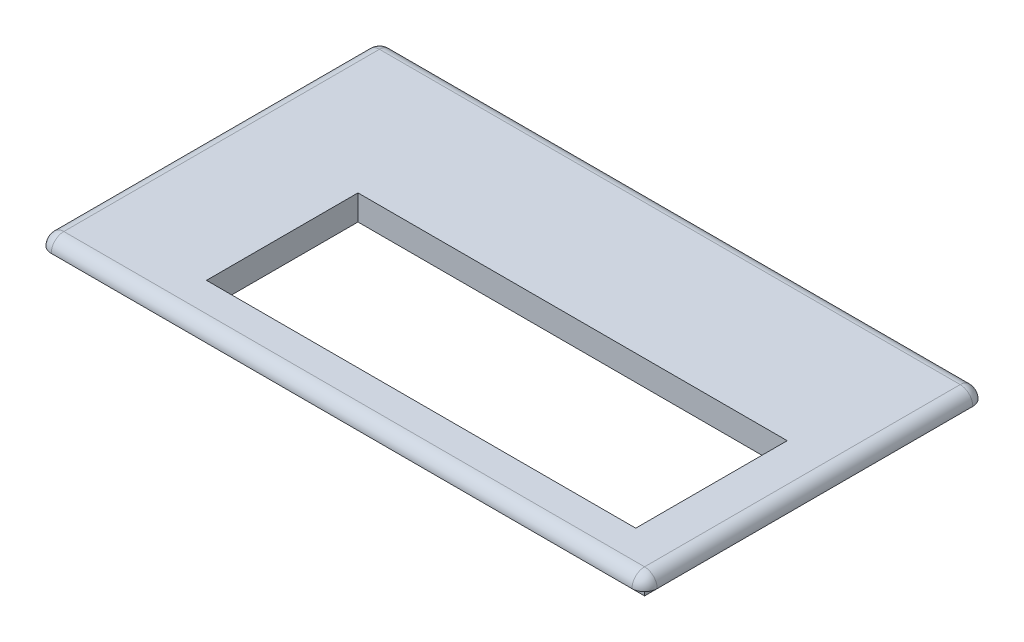
ISO-10303-21;
HEADER;
FILE_DESCRIPTION(('STEP AP214'),'2;1');
FILE_NAME('part.step','',(''),(''),'','','');
FILE_SCHEMA(('AUTOMOTIVE_DESIGN { 1 0 10303 214 1 1 1 1 }'));
ENDSEC;
DATA;
#1=APPLICATION_CONTEXT('core data for automotive mechanical design processes');
#2=APPLICATION_PROTOCOL_DEFINITION('international standard','automotive_design',2000,#1);
#3=PRODUCT_CONTEXT('',#1,'mechanical');
#4=PRODUCT('Part','Part','',(#3));
#5=PRODUCT_RELATED_PRODUCT_CATEGORY('part','',(#4));
#6=PRODUCT_DEFINITION_FORMATION('','',#4);
#7=PRODUCT_DEFINITION_CONTEXT('part definition',#1,'design');
#8=PRODUCT_DEFINITION('design','',#6,#7);
#9=PRODUCT_DEFINITION_SHAPE('','',#8);
#10=(LENGTH_UNIT() NAMED_UNIT(*) SI_UNIT(.MILLI.,.METRE.));
#11=(NAMED_UNIT(*) PLANE_ANGLE_UNIT() SI_UNIT($,.RADIAN.));
#12=(NAMED_UNIT(*) SI_UNIT($,.STERADIAN.) SOLID_ANGLE_UNIT());
#13=UNCERTAINTY_MEASURE_WITH_UNIT(LENGTH_MEASURE(1.E-05),#10,'distance_accuracy_value','');
#14=(GEOMETRIC_REPRESENTATION_CONTEXT(3) GLOBAL_UNCERTAINTY_ASSIGNED_CONTEXT((#13)) GLOBAL_UNIT_ASSIGNED_CONTEXT((#10,
#11,#12)) REPRESENTATION_CONTEXT('',''));
#15=CARTESIAN_POINT('',(0.,0.,0.));
#16=DIRECTION('',(0.,0.,1.));
#17=DIRECTION('',(1.,0.,0.));
#18=AXIS2_PLACEMENT_3D('',#15,#16,#17);
#19=CARTESIAN_POINT('',(-25.8656639223677,1.,-13.1153451083126));
#20=DIRECTION('',(1.,0.,0.));
#21=DIRECTION('',(0.,0.,-1.));
#22=AXIS2_PLACEMENT_3D('',#19,#20,#21);
#23=PLANE('',#22);
#24=DIRECTION('',(0.,0.,1.));
#25=VECTOR('',#24,1.);
#26=CARTESIAN_POINT('',(-25.8656639223677,0.,-13.1153451083126));
#27=LINE('',#26,#25);
#28=CARTESIAN_POINT('',(-25.8656639223677,0.,-13.1153451083126));
#29=VERTEX_POINT('',#28);
#30=CARTESIAN_POINT('',(-25.8656639223677,0.,11.8846548916874));
#31=VERTEX_POINT('',#30);
#32=EDGE_CURVE('E182',#29,#31,#27,.T.);
#33=ORIENTED_EDGE('',*,*,#32,.T.);
#34=DIRECTION('',(0.,-1.,0.));
#35=VECTOR('',#34,1.);
#36=CARTESIAN_POINT('',(-25.8656639223677,1.,11.8846548916874));
#37=LINE('',#36,#35);
#38=CARTESIAN_POINT('',(-25.8656639223677,1.,11.8846548916874));
#39=VERTEX_POINT('',#38);
#40=EDGE_CURVE('E212',#39,#31,#37,.T.);
#41=ORIENTED_EDGE('',*,*,#40,.F.);
#42=DIRECTION('',(0.,0.,1.));
#43=VECTOR('',#42,1.);
#44=CARTESIAN_POINT('',(-25.8656639223677,1.,-13.1153451083126));
#45=LINE('',#44,#43);
#46=CARTESIAN_POINT('',(-25.8656639223677,1.,-13.1153451083126));
#47=VERTEX_POINT('',#46);
#48=EDGE_CURVE('E183',#47,#39,#45,.T.);
#49=ORIENTED_EDGE('',*,*,#48,.F.);
#50=DIRECTION('',(0.,-1.,0.));
#51=VECTOR('',#50,1.);
#52=CARTESIAN_POINT('',(-25.8656639223677,1.,-13.1153451083126));
#53=LINE('',#52,#51);
#54=EDGE_CURVE('E196',#47,#29,#53,.T.);
#55=ORIENTED_EDGE('',*,*,#54,.T.);
#56=EDGE_LOOP('',(#33,#41,#49,#55));
#57=FACE_BOUND('',#56,.T.);
#58=ADVANCED_FACE('F33',(#57),#23,.F.);
#59=CARTESIAN_POINT('',(-25.8656639223677,1.,11.8846548916874));
#60=DIRECTION('',(0.,0.,-1.));
#61=DIRECTION('',(-1.,0.,0.));
#62=AXIS2_PLACEMENT_3D('',#59,#60,#61);
#63=PLANE('',#62);
#64=DIRECTION('',(1.,0.,0.));
#65=VECTOR('',#64,1.);
#66=CARTESIAN_POINT('',(-25.8656639223677,0.,11.8846548916874));
#67=LINE('',#66,#65);
#68=CARTESIAN_POINT('',(20.1343360776323,0.,11.8846548916874));
#69=VERTEX_POINT('',#68);
#70=EDGE_CURVE('E199',#31,#69,#67,.T.);
#71=ORIENTED_EDGE('',*,*,#70,.T.);
#72=DIRECTION('',(0.,-1.,0.));
#73=VECTOR('',#72,1.);
#74=CARTESIAN_POINT('',(20.1343360776323,1.,11.8846548916874));
#75=LINE('',#74,#73);
#76=CARTESIAN_POINT('',(20.1343360776323,1.,11.8846548916874));
#77=VERTEX_POINT('',#76);
#78=EDGE_CURVE('E209',#77,#69,#75,.T.);
#79=ORIENTED_EDGE('',*,*,#78,.F.);
#80=DIRECTION('',(1.,0.,0.));
#81=VECTOR('',#80,1.);
#82=CARTESIAN_POINT('',(-25.8656639223677,1.,11.8846548916874));
#83=LINE('',#82,#81);
#84=EDGE_CURVE('E186',#39,#77,#83,.T.);
#85=ORIENTED_EDGE('',*,*,#84,.F.);
#86=ORIENTED_EDGE('',*,*,#40,.T.);
#87=EDGE_LOOP('',(#71,#79,#85,#86));
#88=FACE_BOUND('',#87,.T.);
#89=ADVANCED_FACE('F289',(#88),#63,.F.);
#90=CARTESIAN_POINT('',(20.1343360776323,1.,-13.1153451083126));
#91=DIRECTION('',(-1.,0.,0.));
#92=DIRECTION('',(0.,0.,1.));
#93=AXIS2_PLACEMENT_3D('',#90,#91,#92);
#94=PLANE('',#93);
#95=DIRECTION('',(0.,0.,-1.));
#96=VECTOR('',#95,1.);
#97=CARTESIAN_POINT('',(20.1343360776323,0.,-13.1153451083126));
#98=LINE('',#97,#96);
#99=CARTESIAN_POINT('',(20.1343360776323,0.,-13.1153451083126));
#100=VERTEX_POINT('',#99);
#101=EDGE_CURVE('E201',#69,#100,#98,.T.);
#102=ORIENTED_EDGE('',*,*,#101,.T.);
#103=DIRECTION('',(0.,-1.,0.));
#104=VECTOR('',#103,1.);
#105=CARTESIAN_POINT('',(20.1343360776323,1.,-13.1153451083126));
#106=LINE('',#105,#104);
#107=CARTESIAN_POINT('',(20.1343360776323,1.,-13.1153451083126));
#108=VERTEX_POINT('',#107);
#109=EDGE_CURVE('E206',#108,#100,#106,.T.);
#110=ORIENTED_EDGE('',*,*,#109,.F.);
#111=DIRECTION('',(0.,0.,-1.));
#112=VECTOR('',#111,1.);
#113=CARTESIAN_POINT('',(20.1343360776323,1.,-13.1153451083126));
#114=LINE('',#113,#112);
#115=EDGE_CURVE('E190',#77,#108,#114,.T.);
#116=ORIENTED_EDGE('',*,*,#115,.F.);
#117=ORIENTED_EDGE('',*,*,#78,.T.);
#118=EDGE_LOOP('',(#102,#110,#116,#117));
#119=FACE_BOUND('',#118,.T.);
#120=ADVANCED_FACE('F295',(#119),#94,.F.);
#121=CARTESIAN_POINT('',(-25.8656639223677,1.,-13.1153451083126));
#122=DIRECTION('',(0.,0.,1.));
#123=DIRECTION('',(1.,0.,0.));
#124=AXIS2_PLACEMENT_3D('',#121,#122,#123);
#125=PLANE('',#124);
#126=DIRECTION('',(-1.,0.,0.));
#127=VECTOR('',#126,1.);
#128=CARTESIAN_POINT('',(-25.8656639223677,0.,-13.1153451083126));
#129=LINE('',#128,#127);
#130=EDGE_CURVE('E187',#100,#29,#129,.T.);
#131=ORIENTED_EDGE('',*,*,#130,.T.);
#132=ORIENTED_EDGE('',*,*,#54,.F.);
#133=DIRECTION('',(-1.,0.,0.));
#134=VECTOR('',#133,1.);
#135=CARTESIAN_POINT('',(-25.8656639223677,1.,-13.1153451083126));
#136=LINE('',#135,#134);
#137=EDGE_CURVE('E193',#108,#47,#136,.T.);
#138=ORIENTED_EDGE('',*,*,#137,.F.);
#139=ORIENTED_EDGE('',*,*,#109,.T.);
#140=EDGE_LOOP('',(#131,#132,#138,#139));
#141=FACE_BOUND('',#140,.T.);
#142=ADVANCED_FACE('F412',(#141),#125,.F.);
#143=CARTESIAN_POINT('',(0.,0.,0.));
#144=DIRECTION('',(0.,1.,0.));
#145=DIRECTION('',(0.,0.,1.));
#146=AXIS2_PLACEMENT_3D('',#143,#144,#145);
#147=PLANE('',#146);
#148=DIRECTION('',(1.,0.,0.));
#149=VECTOR('',#148,1.);
#150=CARTESIAN_POINT('',(-16.8656639223677,0.,-2.41534510831259));
#151=LINE('',#150,#149);
#152=CARTESIAN_POINT('',(-16.8656639223677,0.,-2.41534510831259));
#153=VERTEX_POINT('',#152);
#154=CARTESIAN_POINT('',(17.1343360776323,0.,-2.41534510831259));
#155=VERTEX_POINT('',#154);
#156=EDGE_CURVE('E140',#153,#155,#151,.T.);
#157=ORIENTED_EDGE('',*,*,#156,.F.);
#158=DIRECTION('',(0.,0.,1.));
#159=VECTOR('',#158,1.);
#160=CARTESIAN_POINT('',(-16.8656639223677,0.,-2.41534510831259));
#161=LINE('',#160,#159);
#162=CARTESIAN_POINT('',(-16.8656639223677,0.,9.58465489168741));
#163=VERTEX_POINT('',#162);
#164=EDGE_CURVE('E137',#153,#163,#161,.T.);
#165=ORIENTED_EDGE('',*,*,#164,.T.);
#166=DIRECTION('',(1.,0.,0.));
#167=VECTOR('',#166,1.);
#168=CARTESIAN_POINT('',(-16.8656639223677,0.,9.58465489168741));
#169=LINE('',#168,#167);
#170=CARTESIAN_POINT('',(17.1343360776323,0.,9.58465489168741));
#171=VERTEX_POINT('',#170);
#172=EDGE_CURVE('E143',#163,#171,#169,.T.);
#173=ORIENTED_EDGE('',*,*,#172,.T.);
#174=DIRECTION('',(0.,0.,1.));
#175=VECTOR('',#174,1.);
#176=CARTESIAN_POINT('',(17.1343360776323,0.,-2.41534510831259));
#177=LINE('',#176,#175);
#178=EDGE_CURVE('E147',#155,#171,#177,.T.);
#179=ORIENTED_EDGE('',*,*,#178,.F.);
#180=EDGE_LOOP('',(#157,#165,#173,#179));
#181=FACE_BOUND('',#180,.T.);
#182=ORIENTED_EDGE('',*,*,#32,.F.);
#183=ORIENTED_EDGE('',*,*,#130,.F.);
#184=ORIENTED_EDGE('',*,*,#101,.F.);
#185=ORIENTED_EDGE('',*,*,#70,.F.);
#186=EDGE_LOOP('',(#182,#183,#184,#185));
#187=FACE_BOUND('',#186,.T.);
#188=ADVANCED_FACE('F149',(#181,#187),#147,.F.);
#189=CARTESIAN_POINT('',(0.,1.,0.));
#190=DIRECTION('',(0.,1.,0.));
#191=DIRECTION('',(0.,0.,1.));
#192=AXIS2_PLACEMENT_3D('',#189,#190,#191);
#193=PLANE('',#192);
#194=DIRECTION('',(-1.,0.,0.));
#195=VECTOR('',#194,1.);
#196=CARTESIAN_POINT('',(-26.8656639223677,1.,-14.1153451083126));
#197=LINE('',#196,#195);
#198=CARTESIAN_POINT('',(20.1343360776323,1.,-14.1153451083126));
#199=VERTEX_POINT('',#198);
#200=CARTESIAN_POINT('',(-25.8656639223677,1.,-14.1153451083126));
#201=VERTEX_POINT('',#200);
#202=EDGE_CURVE('E179',#199,#201,#197,.T.);
#203=ORIENTED_EDGE('',*,*,#202,.F.);
#204=CARTESIAN_POINT('',(20.1343360776323,1.,-13.1153451083126));
#205=DIRECTION('',(0.,1.,0.));
#206=DIRECTION('',(0.,0.,1.));
#207=AXIS2_PLACEMENT_3D('',#204,#205,#206);
#208=CIRCLE('',#207,1.);
#209=CARTESIAN_POINT('',(21.1343360776323,1.,-13.1153451083126));
#210=VERTEX_POINT('',#209);
#211=EDGE_CURVE('E11',#199,#210,#208,.F.);
#212=ORIENTED_EDGE('',*,*,#211,.T.);
#213=DIRECTION('',(0.,0.,-1.));
#214=VECTOR('',#213,1.);
#215=CARTESIAN_POINT('',(21.1343360776323,1.,-14.1153451083126));
#216=LINE('',#215,#214);
#217=CARTESIAN_POINT('',(21.1343360776323,1.,11.8846548916874));
#218=VERTEX_POINT('',#217);
#219=EDGE_CURVE('E176',#218,#210,#216,.T.);
#220=ORIENTED_EDGE('',*,*,#219,.F.);
#221=CARTESIAN_POINT('',(20.1343360776323,1.,11.8846548916874));
#222=DIRECTION('',(0.,1.,0.));
#223=DIRECTION('',(0.,0.,1.));
#224=AXIS2_PLACEMENT_3D('',#221,#222,#223);
#225=CIRCLE('',#224,1.);
#226=CARTESIAN_POINT('',(20.1343360776323,1.,12.8846548916874));
#227=VERTEX_POINT('',#226);
#228=EDGE_CURVE('E42',#218,#227,#225,.F.);
#229=ORIENTED_EDGE('',*,*,#228,.T.);
#230=DIRECTION('',(1.,0.,0.));
#231=VECTOR('',#230,1.);
#232=CARTESIAN_POINT('',(-26.8656639223677,1.,12.8846548916874));
#233=LINE('',#232,#231);
#234=CARTESIAN_POINT('',(-25.8656639223677,1.,12.8846548916874));
#235=VERTEX_POINT('',#234);
#236=EDGE_CURVE('E173',#235,#227,#233,.T.);
#237=ORIENTED_EDGE('',*,*,#236,.F.);
#238=CARTESIAN_POINT('',(-25.8656639223677,1.,11.8846548916874));
#239=DIRECTION('',(0.,1.,0.));
#240=DIRECTION('',(0.,0.,1.));
#241=AXIS2_PLACEMENT_3D('',#238,#239,#240);
#242=CIRCLE('',#241,1.);
#243=CARTESIAN_POINT('',(-26.8656639223677,1.,11.8846548916874));
#244=VERTEX_POINT('',#243);
#245=EDGE_CURVE('E226',#235,#244,#242,.F.);
#246=ORIENTED_EDGE('',*,*,#245,.T.);
#247=DIRECTION('',(0.,0.,1.));
#248=VECTOR('',#247,1.);
#249=CARTESIAN_POINT('',(-26.8656639223677,1.,-14.1153451083126));
#250=LINE('',#249,#248);
#251=CARTESIAN_POINT('',(-26.8656639223677,1.,-13.1153451083126));
#252=VERTEX_POINT('',#251);
#253=EDGE_CURVE('E170',#252,#244,#250,.T.);
#254=ORIENTED_EDGE('',*,*,#253,.F.);
#255=CARTESIAN_POINT('',(-25.8656639223677,1.,-13.1153451083126));
#256=DIRECTION('',(0.,1.,0.));
#257=DIRECTION('',(0.,0.,1.));
#258=AXIS2_PLACEMENT_3D('',#255,#256,#257);
#259=CIRCLE('',#258,1.);
#260=EDGE_CURVE('E224',#252,#201,#259,.F.);
#261=ORIENTED_EDGE('',*,*,#260,.T.);
#262=EDGE_LOOP('',(#203,#212,#220,#229,#237,#246,#254,#261));
#263=FACE_BOUND('',#262,.T.);
#264=ORIENTED_EDGE('',*,*,#137,.T.);
#265=ORIENTED_EDGE('',*,*,#48,.T.);
#266=ORIENTED_EDGE('',*,*,#84,.T.);
#267=ORIENTED_EDGE('',*,*,#115,.T.);
#268=EDGE_LOOP('',(#264,#265,#266,#267));
#269=FACE_BOUND('',#268,.T.);
#270=ADVANCED_FACE('F259',(#263,#269),#193,.F.);
#271=CARTESIAN_POINT('',(0.,2.,0.));
#272=DIRECTION('',(0.,1.,0.));
#273=DIRECTION('',(0.,0.,1.));
#274=AXIS2_PLACEMENT_3D('',#271,#272,#273);
#275=PLANE('',#274);
#276=DIRECTION('',(0.,0.,1.));
#277=VECTOR('',#276,1.);
#278=CARTESIAN_POINT('',(-16.8656639223677,2.,-2.41534510831259));
#279=LINE('',#278,#277);
#280=CARTESIAN_POINT('',(-16.8656639223677,2.,-2.41534510831259));
#281=VERTEX_POINT('',#280);
#282=CARTESIAN_POINT('',(-16.8656639223677,2.,9.58465489168741));
#283=VERTEX_POINT('',#282);
#284=EDGE_CURVE('E58',#281,#283,#279,.T.);
#285=ORIENTED_EDGE('',*,*,#284,.F.);
#286=DIRECTION('',(1.,0.,0.));
#287=VECTOR('',#286,1.);
#288=CARTESIAN_POINT('',(-16.8656639223677,2.,-2.41534510831259));
#289=LINE('',#288,#287);
#290=CARTESIAN_POINT('',(17.1343360776323,2.,-2.41534510831259));
#291=VERTEX_POINT('',#290);
#292=EDGE_CURVE('E151',#281,#291,#289,.T.);
#293=ORIENTED_EDGE('',*,*,#292,.T.);
#294=DIRECTION('',(0.,0.,1.));
#295=VECTOR('',#294,1.);
#296=CARTESIAN_POINT('',(17.1343360776323,2.,-2.41534510831259));
#297=LINE('',#296,#295);
#298=CARTESIAN_POINT('',(17.1343360776323,2.,9.58465489168741));
#299=VERTEX_POINT('',#298);
#300=EDGE_CURVE('E154',#291,#299,#297,.T.);
#301=ORIENTED_EDGE('',*,*,#300,.T.);
#302=DIRECTION('',(1.,0.,0.));
#303=VECTOR('',#302,1.);
#304=CARTESIAN_POINT('',(-16.8656639223677,2.,9.58465489168741));
#305=LINE('',#304,#303);
#306=EDGE_CURVE('E160',#283,#299,#305,.T.);
#307=ORIENTED_EDGE('',*,*,#306,.F.);
#308=EDGE_LOOP('',(#285,#293,#301,#307));
#309=FACE_BOUND('',#308,.T.);
#310=DIRECTION('',(-1.,0.,0.));
#311=VECTOR('',#310,1.);
#312=CARTESIAN_POINT('',(-26.8656639223677,2.,-13.1153451083126));
#313=LINE('',#312,#311);
#314=CARTESIAN_POINT('',(20.1343360776323,2.,-13.1153451083126));
#315=VERTEX_POINT('',#314);
#316=CARTESIAN_POINT('',(-25.8656639223677,2.,-13.1153451083126));
#317=VERTEX_POINT('',#316);
#318=EDGE_CURVE('E217',#315,#317,#313,.T.);
#319=ORIENTED_EDGE('',*,*,#318,.T.);
#320=DIRECTION('',(0.,0.,1.));
#321=VECTOR('',#320,1.);
#322=CARTESIAN_POINT('',(-25.8656639223677,2.,12.8846548916874));
#323=LINE('',#322,#321);
#324=CARTESIAN_POINT('',(-25.8656639223677,2.,11.8846548916874));
#325=VERTEX_POINT('',#324);
#326=EDGE_CURVE('E221',#317,#325,#323,.T.);
#327=ORIENTED_EDGE('',*,*,#326,.T.);
#328=DIRECTION('',(1.,0.,0.));
#329=VECTOR('',#328,1.);
#330=CARTESIAN_POINT('',(21.1343360776323,2.,11.8846548916874));
#331=LINE('',#330,#329);
#332=CARTESIAN_POINT('',(20.1343360776323,2.,11.8846548916874));
#333=VERTEX_POINT('',#332);
#334=EDGE_CURVE('E219',#325,#333,#331,.T.);
#335=ORIENTED_EDGE('',*,*,#334,.T.);
#336=DIRECTION('',(0.,0.,-1.));
#337=VECTOR('',#336,1.);
#338=CARTESIAN_POINT('',(20.1343360776323,2.,-14.1153451083126));
#339=LINE('',#338,#337);
#340=EDGE_CURVE('E215',#333,#315,#339,.T.);
#341=ORIENTED_EDGE('',*,*,#340,.T.);
#342=EDGE_LOOP('',(#319,#327,#335,#341));
#343=FACE_BOUND('',#342,.T.);
#344=ADVANCED_FACE('F274',(#309,#343),#275,.T.);
#345=CARTESIAN_POINT('',(20.1343360776323,1.,0.));
#346=DIRECTION('',(0.,0.,1.));
#347=DIRECTION('',(1.,0.,0.));
#348=AXIS2_PLACEMENT_3D('',#345,#346,#347);
#349=CYLINDRICAL_SURFACE('',#348,1.);
#350=CARTESIAN_POINT('',(20.1343360776323,1.,11.8846548916874));
#351=DIRECTION('',(0.,0.,1.));
#352=DIRECTION('',(1.,0.,0.));
#353=AXIS2_PLACEMENT_3D('',#350,#351,#352);
#354=CIRCLE('',#353,1.);
#355=EDGE_CURVE('E243',#218,#333,#354,.T.);
#356=ORIENTED_EDGE('',*,*,#355,.F.);
#357=ORIENTED_EDGE('',*,*,#219,.T.);
#358=CARTESIAN_POINT('',(20.1343360776323,1.,-13.1153451083126));
#359=DIRECTION('',(0.,0.,-1.));
#360=DIRECTION('',(-1.,0.,0.));
#361=AXIS2_PLACEMENT_3D('',#358,#359,#360);
#362=CIRCLE('',#361,1.);
#363=EDGE_CURVE('E37',#315,#210,#362,.T.);
#364=ORIENTED_EDGE('',*,*,#363,.F.);
#365=ORIENTED_EDGE('',*,*,#340,.F.);
#366=EDGE_LOOP('',(#356,#357,#364,#365));
#367=FACE_BOUND('',#366,.T.);
#368=ADVANCED_FACE('F35',(#367),#349,.T.);
#369=CARTESIAN_POINT('',(20.1343360776323,1.,-13.1153451083126));
#370=DIRECTION('',(0.,0.,1.));
#371=DIRECTION('',(1.,0.,0.));
#372=AXIS2_PLACEMENT_3D('',#369,#370,#371);
#373=SPHERICAL_SURFACE('',#372,1.);
#374=ORIENTED_EDGE('',*,*,#363,.T.);
#375=ORIENTED_EDGE('',*,*,#211,.F.);
#376=CARTESIAN_POINT('',(20.1343360776323,1.,-13.1153451083126));
#377=DIRECTION('',(1.,0.,0.));
#378=DIRECTION('',(0.,0.,-1.));
#379=AXIS2_PLACEMENT_3D('',#376,#377,#378);
#380=CIRCLE('',#379,1.);
#381=EDGE_CURVE('E241',#315,#199,#380,.F.);
#382=ORIENTED_EDGE('',*,*,#381,.F.);
#383=EDGE_LOOP('',(#374,#375,#382));
#384=FACE_BOUND('',#383,.T.);
#385=ADVANCED_FACE('F254',(#384),#373,.T.);
#386=CARTESIAN_POINT('',(20.1343360776323,1.,11.8846548916874));
#387=DIRECTION('',(0.,0.,1.));
#388=DIRECTION('',(1.,0.,0.));
#389=AXIS2_PLACEMENT_3D('',#386,#387,#388);
#390=SPHERICAL_SURFACE('',#389,1.);
#391=ORIENTED_EDGE('',*,*,#228,.F.);
#392=ORIENTED_EDGE('',*,*,#355,.T.);
#393=CARTESIAN_POINT('',(20.1343360776323,1.,11.8846548916874));
#394=DIRECTION('',(1.,0.,0.));
#395=DIRECTION('',(0.,0.,-1.));
#396=AXIS2_PLACEMENT_3D('',#393,#394,#395);
#397=CIRCLE('',#396,1.);
#398=EDGE_CURVE('E238',#227,#333,#397,.F.);
#399=ORIENTED_EDGE('',*,*,#398,.F.);
#400=EDGE_LOOP('',(#391,#392,#399));
#401=FACE_BOUND('',#400,.T.);
#402=ADVANCED_FACE('F280',(#401),#390,.T.);
#403=CARTESIAN_POINT('',(0.,1.,-13.1153451083126));
#404=DIRECTION('',(1.,0.,0.));
#405=DIRECTION('',(0.,0.,-1.));
#406=AXIS2_PLACEMENT_3D('',#403,#404,#405);
#407=CYLINDRICAL_SURFACE('',#406,1.);
#408=ORIENTED_EDGE('',*,*,#381,.T.);
#409=ORIENTED_EDGE('',*,*,#202,.T.);
#410=CARTESIAN_POINT('',(-25.8656639223677,1.,-13.1153451083126));
#411=DIRECTION('',(-1.,0.,0.));
#412=DIRECTION('',(0.,0.,1.));
#413=AXIS2_PLACEMENT_3D('',#410,#411,#412);
#414=CIRCLE('',#413,1.);
#415=EDGE_CURVE('E235',#317,#201,#414,.T.);
#416=ORIENTED_EDGE('',*,*,#415,.F.);
#417=ORIENTED_EDGE('',*,*,#318,.F.);
#418=EDGE_LOOP('',(#408,#409,#416,#417));
#419=FACE_BOUND('',#418,.T.);
#420=ADVANCED_FACE('F265',(#419),#407,.T.);
#421=CARTESIAN_POINT('',(0.,1.,11.8846548916874));
#422=DIRECTION('',(-1.,0.,0.));
#423=DIRECTION('',(0.,0.,1.));
#424=AXIS2_PLACEMENT_3D('',#421,#422,#423);
#425=CYLINDRICAL_SURFACE('',#424,1.);
#426=ORIENTED_EDGE('',*,*,#398,.T.);
#427=ORIENTED_EDGE('',*,*,#334,.F.);
#428=CARTESIAN_POINT('',(-25.8656639223677,1.,11.8846548916874));
#429=DIRECTION('',(-1.,0.,0.));
#430=DIRECTION('',(0.,0.,1.));
#431=AXIS2_PLACEMENT_3D('',#428,#429,#430);
#432=CIRCLE('',#431,1.);
#433=EDGE_CURVE('E232',#235,#325,#432,.T.);
#434=ORIENTED_EDGE('',*,*,#433,.F.);
#435=ORIENTED_EDGE('',*,*,#236,.T.);
#436=EDGE_LOOP('',(#426,#427,#434,#435));
#437=FACE_BOUND('',#436,.T.);
#438=ADVANCED_FACE('F278',(#437),#425,.T.);
#439=CARTESIAN_POINT('',(-25.8656639223677,1.,-13.1153451083126));
#440=DIRECTION('',(0.,0.,1.));
#441=DIRECTION('',(1.,0.,0.));
#442=AXIS2_PLACEMENT_3D('',#439,#440,#441);
#443=SPHERICAL_SURFACE('',#442,1.);
#444=ORIENTED_EDGE('',*,*,#415,.T.);
#445=ORIENTED_EDGE('',*,*,#260,.F.);
#446=CARTESIAN_POINT('',(-25.8656639223677,1.,-13.1153451083126));
#447=DIRECTION('',(0.,0.,-1.));
#448=DIRECTION('',(-1.,0.,0.));
#449=AXIS2_PLACEMENT_3D('',#446,#447,#448);
#450=CIRCLE('',#449,1.);
#451=EDGE_CURVE('E230',#317,#252,#450,.F.);
#452=ORIENTED_EDGE('',*,*,#451,.F.);
#453=EDGE_LOOP('',(#444,#445,#452));
#454=FACE_BOUND('',#453,.T.);
#455=ADVANCED_FACE('F268',(#454),#443,.T.);
#456=CARTESIAN_POINT('',(-25.8656639223677,1.,11.8846548916874));
#457=DIRECTION('',(0.,0.,1.));
#458=DIRECTION('',(1.,0.,0.));
#459=AXIS2_PLACEMENT_3D('',#456,#457,#458);
#460=SPHERICAL_SURFACE('',#459,1.);
#461=ORIENTED_EDGE('',*,*,#245,.F.);
#462=ORIENTED_EDGE('',*,*,#433,.T.);
#463=CARTESIAN_POINT('',(-25.8656639223677,1.,11.8846548916874));
#464=DIRECTION('',(0.,0.,1.));
#465=DIRECTION('',(1.,0.,0.));
#466=AXIS2_PLACEMENT_3D('',#463,#464,#465);
#467=CIRCLE('',#466,1.);
#468=EDGE_CURVE('E166',#244,#325,#467,.F.);
#469=ORIENTED_EDGE('',*,*,#468,.F.);
#470=EDGE_LOOP('',(#461,#462,#469));
#471=FACE_BOUND('',#470,.T.);
#472=ADVANCED_FACE('F302',(#471),#460,.T.);
#473=CARTESIAN_POINT('',(-25.8656639223677,1.,0.));
#474=DIRECTION('',(0.,0.,-1.));
#475=DIRECTION('',(-1.,0.,0.));
#476=AXIS2_PLACEMENT_3D('',#473,#474,#475);
#477=CYLINDRICAL_SURFACE('',#476,1.);
#478=ORIENTED_EDGE('',*,*,#451,.T.);
#479=ORIENTED_EDGE('',*,*,#253,.T.);
#480=ORIENTED_EDGE('',*,*,#468,.T.);
#481=ORIENTED_EDGE('',*,*,#326,.F.);
#482=EDGE_LOOP('',(#478,#479,#480,#481));
#483=FACE_BOUND('',#482,.T.);
#484=ADVANCED_FACE('F271',(#483),#477,.T.);
#485=CARTESIAN_POINT('',(-16.8656639223677,0.,-2.41534510831259));
#486=DIRECTION('',(-1.,0.,0.));
#487=DIRECTION('',(0.,0.,1.));
#488=AXIS2_PLACEMENT_3D('',#485,#486,#487);
#489=PLANE('',#488);
#490=ORIENTED_EDGE('',*,*,#284,.T.);
#491=DIRECTION('',(0.,1.,0.));
#492=VECTOR('',#491,1.);
#493=CARTESIAN_POINT('',(-16.8656639223677,0.,9.58465489168741));
#494=LINE('',#493,#492);
#495=EDGE_CURVE('E134',#163,#283,#494,.T.);
#496=ORIENTED_EDGE('',*,*,#495,.F.);
#497=ORIENTED_EDGE('',*,*,#164,.F.);
#498=DIRECTION('',(0.,1.,0.));
#499=VECTOR('',#498,1.);
#500=CARTESIAN_POINT('',(-16.8656639223677,0.,-2.41534510831259));
#501=LINE('',#500,#499);
#502=EDGE_CURVE('E164',#153,#281,#501,.T.);
#503=ORIENTED_EDGE('',*,*,#502,.T.);
#504=EDGE_LOOP('',(#490,#496,#497,#503));
#505=FACE_BOUND('',#504,.T.);
#506=ADVANCED_FACE('F135',(#505),#489,.F.);
#507=CARTESIAN_POINT('',(-16.8656639223677,0.,-2.41534510831259));
#508=DIRECTION('',(0.,0.,1.));
#509=DIRECTION('',(1.,0.,0.));
#510=AXIS2_PLACEMENT_3D('',#507,#508,#509);
#511=PLANE('',#510);
#512=ORIENTED_EDGE('',*,*,#292,.F.);
#513=ORIENTED_EDGE('',*,*,#502,.F.);
#514=ORIENTED_EDGE('',*,*,#156,.T.);
#515=DIRECTION('',(0.,1.,0.));
#516=VECTOR('',#515,1.);
#517=CARTESIAN_POINT('',(17.1343360776323,0.,-2.41534510831259));
#518=LINE('',#517,#516);
#519=EDGE_CURVE('E167',#155,#291,#518,.T.);
#520=ORIENTED_EDGE('',*,*,#519,.T.);
#521=EDGE_LOOP('',(#512,#513,#514,#520));
#522=FACE_BOUND('',#521,.T.);
#523=ADVANCED_FACE('F332',(#522),#511,.T.);
#524=CARTESIAN_POINT('',(17.1343360776323,0.,-2.41534510831259));
#525=DIRECTION('',(-1.,0.,0.));
#526=DIRECTION('',(0.,0.,1.));
#527=AXIS2_PLACEMENT_3D('',#524,#525,#526);
#528=PLANE('',#527);
#529=ORIENTED_EDGE('',*,*,#300,.F.);
#530=ORIENTED_EDGE('',*,*,#519,.F.);
#531=ORIENTED_EDGE('',*,*,#178,.T.);
#532=DIRECTION('',(0.,1.,0.));
#533=VECTOR('',#532,1.);
#534=CARTESIAN_POINT('',(17.1343360776323,0.,9.58465489168741));
#535=LINE('',#534,#533);
#536=EDGE_CURVE('E50',#171,#299,#535,.T.);
#537=ORIENTED_EDGE('',*,*,#536,.T.);
#538=EDGE_LOOP('',(#529,#530,#531,#537));
#539=FACE_BOUND('',#538,.T.);
#540=ADVANCED_FACE('F340',(#539),#528,.T.);
#541=CARTESIAN_POINT('',(-16.8656639223677,0.,9.58465489168741));
#542=DIRECTION('',(0.,0.,1.));
#543=DIRECTION('',(1.,0.,0.));
#544=AXIS2_PLACEMENT_3D('',#541,#542,#543);
#545=PLANE('',#544);
#546=ORIENTED_EDGE('',*,*,#306,.T.);
#547=ORIENTED_EDGE('',*,*,#536,.F.);
#548=ORIENTED_EDGE('',*,*,#172,.F.);
#549=ORIENTED_EDGE('',*,*,#495,.T.);
#550=EDGE_LOOP('',(#546,#547,#548,#549));
#551=FACE_BOUND('',#550,.T.);
#552=ADVANCED_FACE('F144',(#551),#545,.F.);
#553=CLOSED_SHELL('',(#58,#89,#120,#142,#188,#270,#344,#368,#385,#402,#420,#438,#455,#472,#484,
#506,#523,#540,#552));
#554=MANIFOLD_SOLID_BREP('B2',#553);
#555=ADVANCED_BREP_SHAPE_REPRESENTATION('',(#18,#554),#14);
#556=SHAPE_DEFINITION_REPRESENTATION(#9,#555);
ENDSEC;
END-ISO-10303-21;
